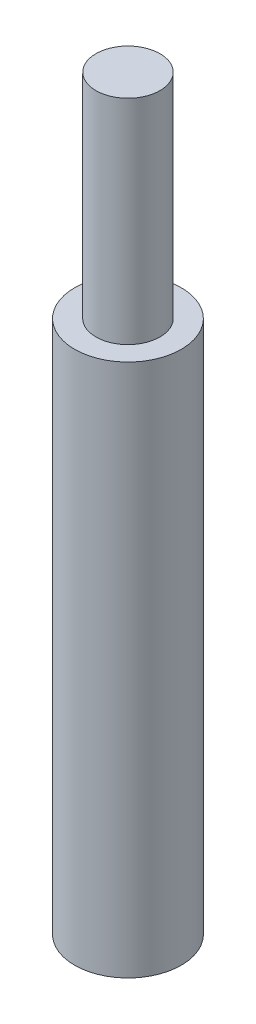
ISO-10303-21;
HEADER;
FILE_DESCRIPTION(('STEP AP214'),'2;1');
FILE_NAME('part.step','',(''),(''),'','','');
FILE_SCHEMA(('AUTOMOTIVE_DESIGN { 1 0 10303 214 1 1 1 1 }'));
ENDSEC;
DATA;
#1=APPLICATION_CONTEXT('core data for automotive mechanical design processes');
#2=APPLICATION_PROTOCOL_DEFINITION('international standard','automotive_design',2000,#1);
#3=PRODUCT_CONTEXT('',#1,'mechanical');
#4=PRODUCT('Part','Part','',(#3));
#5=PRODUCT_RELATED_PRODUCT_CATEGORY('part','',(#4));
#6=PRODUCT_DEFINITION_FORMATION('','',#4);
#7=PRODUCT_DEFINITION_CONTEXT('part definition',#1,'design');
#8=PRODUCT_DEFINITION('design','',#6,#7);
#9=PRODUCT_DEFINITION_SHAPE('','',#8);
#10=(LENGTH_UNIT() NAMED_UNIT(*) SI_UNIT(.MILLI.,.METRE.));
#11=(NAMED_UNIT(*) PLANE_ANGLE_UNIT() SI_UNIT($,.RADIAN.));
#12=(NAMED_UNIT(*) SI_UNIT($,.STERADIAN.) SOLID_ANGLE_UNIT());
#13=UNCERTAINTY_MEASURE_WITH_UNIT(LENGTH_MEASURE(1.E-05),#10,'distance_accuracy_value','');
#14=(GEOMETRIC_REPRESENTATION_CONTEXT(3) GLOBAL_UNCERTAINTY_ASSIGNED_CONTEXT((#13)) GLOBAL_UNIT_ASSIGNED_CONTEXT((#10,
#11,#12)) REPRESENTATION_CONTEXT('',''));
#15=CARTESIAN_POINT('',(0.,0.,0.));
#16=DIRECTION('',(0.,0.,1.));
#17=DIRECTION('',(1.,0.,0.));
#18=AXIS2_PLACEMENT_3D('',#15,#16,#17);
#19=CARTESIAN_POINT('',(0.,25.,0.));
#20=DIRECTION('',(0.,-1.,0.));
#21=DIRECTION('',(0.,0.,-1.));
#22=AXIS2_PLACEMENT_3D('',#19,#20,#21);
#23=CYLINDRICAL_SURFACE('',#22,2.5);
#24=CARTESIAN_POINT('',(0.,25.,0.));
#25=DIRECTION('',(0.,1.,0.));
#26=DIRECTION('',(0.,0.,1.));
#27=AXIS2_PLACEMENT_3D('',#24,#25,#26);
#28=CIRCLE('',#27,2.5);
#29=CARTESIAN_POINT('',(0.,25.,2.5));
#30=VERTEX_POINT('',#29);
#31=EDGE_CURVE('E38',#30,#30,#28,.T.);
#32=ORIENTED_EDGE('',*,*,#31,.F.);
#33=EDGE_LOOP('',(#32));
#34=FACE_BOUND('',#33,.T.);
#35=CARTESIAN_POINT('',(0.,0.,0.));
#36=DIRECTION('',(0.,1.,0.));
#37=DIRECTION('',(0.,0.,1.));
#38=AXIS2_PLACEMENT_3D('',#35,#36,#37);
#39=CIRCLE('',#38,2.5);
#40=CARTESIAN_POINT('',(0.,0.,2.5));
#41=VERTEX_POINT('',#40);
#42=EDGE_CURVE('E34',#41,#41,#39,.T.);
#43=ORIENTED_EDGE('',*,*,#42,.T.);
#44=EDGE_LOOP('',(#43));
#45=FACE_BOUND('',#44,.T.);
#46=ADVANCED_FACE('F31',(#34,#45),#23,.T.);
#47=CARTESIAN_POINT('',(0.,25.,0.));
#48=DIRECTION('',(0.,1.,0.));
#49=DIRECTION('',(0.,0.,1.));
#50=AXIS2_PLACEMENT_3D('',#47,#48,#49);
#51=PLANE('',#50);
#52=CARTESIAN_POINT('',(0.,25.,0.));
#53=DIRECTION('',(0.,1.,0.));
#54=DIRECTION('',(0.,0.,1.));
#55=AXIS2_PLACEMENT_3D('',#52,#53,#54);
#56=CIRCLE('',#55,1.5);
#57=CARTESIAN_POINT('',(0.,25.,1.5));
#58=VERTEX_POINT('',#57);
#59=EDGE_CURVE('E10',#58,#58,#56,.T.);
#60=ORIENTED_EDGE('',*,*,#59,.F.);
#61=EDGE_LOOP('',(#60));
#62=FACE_BOUND('',#61,.T.);
#63=ORIENTED_EDGE('',*,*,#31,.T.);
#64=EDGE_LOOP('',(#63));
#65=FACE_BOUND('',#64,.T.);
#66=ADVANCED_FACE('F55',(#62,#65),#51,.T.);
#67=CARTESIAN_POINT('',(0.,0.,0.));
#68=DIRECTION('',(0.,1.,0.));
#69=DIRECTION('',(0.,0.,1.));
#70=AXIS2_PLACEMENT_3D('',#67,#68,#69);
#71=PLANE('',#70);
#72=ORIENTED_EDGE('',*,*,#42,.F.);
#73=EDGE_LOOP('',(#72));
#74=FACE_BOUND('',#73,.T.);
#75=ADVANCED_FACE('F52',(#74),#71,.F.);
#76=CARTESIAN_POINT('',(0.,35.,0.));
#77=DIRECTION('',(0.,-1.,0.));
#78=DIRECTION('',(0.,0.,-1.));
#79=AXIS2_PLACEMENT_3D('',#76,#77,#78);
#80=CYLINDRICAL_SURFACE('',#79,1.5);
#81=CARTESIAN_POINT('',(0.,35.,0.));
#82=DIRECTION('',(0.,1.,0.));
#83=DIRECTION('',(0.,0.,1.));
#84=AXIS2_PLACEMENT_3D('',#81,#82,#83);
#85=CIRCLE('',#84,1.5);
#86=CARTESIAN_POINT('',(0.,35.,1.5));
#87=VERTEX_POINT('',#86);
#88=EDGE_CURVE('E44',#87,#87,#85,.T.);
#89=ORIENTED_EDGE('',*,*,#88,.F.);
#90=EDGE_LOOP('',(#89));
#91=FACE_BOUND('',#90,.T.);
#92=ORIENTED_EDGE('',*,*,#59,.T.);
#93=EDGE_LOOP('',(#92));
#94=FACE_BOUND('',#93,.T.);
#95=ADVANCED_FACE('F54',(#91,#94),#80,.T.);
#96=CARTESIAN_POINT('',(0.,35.,0.));
#97=DIRECTION('',(0.,1.,0.));
#98=DIRECTION('',(0.,0.,1.));
#99=AXIS2_PLACEMENT_3D('',#96,#97,#98);
#100=PLANE('',#99);
#101=ORIENTED_EDGE('',*,*,#88,.T.);
#102=EDGE_LOOP('',(#101));
#103=FACE_BOUND('',#102,.T.);
#104=ADVANCED_FACE('F60',(#103),#100,.T.);
#105=CLOSED_SHELL('',(#46,#66,#75,#95,#104));
#106=MANIFOLD_SOLID_BREP('B2',#105);
#107=ADVANCED_BREP_SHAPE_REPRESENTATION('',(#18,#106),#14);
#108=SHAPE_DEFINITION_REPRESENTATION(#9,#107);
ENDSEC;
END-ISO-10303-21;
